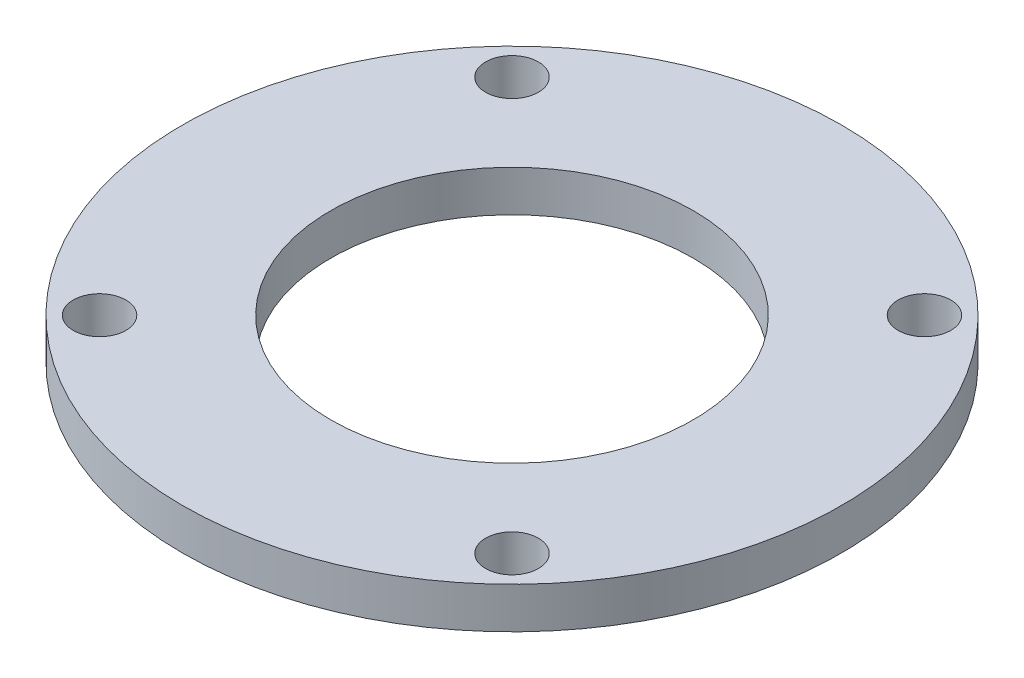
ISO-10303-21;
HEADER;
FILE_DESCRIPTION(('STEP AP214'),'2;1');
FILE_NAME('part.step','',(''),(''),'','','');
FILE_SCHEMA(('AUTOMOTIVE_DESIGN { 1 0 10303 214 1 1 1 1 }'));
ENDSEC;
DATA;
#1=APPLICATION_CONTEXT('core data for automotive mechanical design processes');
#2=APPLICATION_PROTOCOL_DEFINITION('international standard','automotive_design',2000,#1);
#3=PRODUCT_CONTEXT('',#1,'mechanical');
#4=PRODUCT('Part','Part','',(#3));
#5=PRODUCT_RELATED_PRODUCT_CATEGORY('part','',(#4));
#6=PRODUCT_DEFINITION_FORMATION('','',#4);
#7=PRODUCT_DEFINITION_CONTEXT('part definition',#1,'design');
#8=PRODUCT_DEFINITION('design','',#6,#7);
#9=PRODUCT_DEFINITION_SHAPE('','',#8);
#10=(LENGTH_UNIT() NAMED_UNIT(*) SI_UNIT(.MILLI.,.METRE.));
#11=(NAMED_UNIT(*) PLANE_ANGLE_UNIT() SI_UNIT($,.RADIAN.));
#12=(NAMED_UNIT(*) SI_UNIT($,.STERADIAN.) SOLID_ANGLE_UNIT());
#13=UNCERTAINTY_MEASURE_WITH_UNIT(LENGTH_MEASURE(1.E-05),#10,'distance_accuracy_value','');
#14=(GEOMETRIC_REPRESENTATION_CONTEXT(3) GLOBAL_UNCERTAINTY_ASSIGNED_CONTEXT((#13)) GLOBAL_UNIT_ASSIGNED_CONTEXT((#10,
#11,#12)) REPRESENTATION_CONTEXT('',''));
#15=CARTESIAN_POINT('',(0.,0.,0.));
#16=DIRECTION('',(0.,0.,1.));
#17=DIRECTION('',(1.,0.,0.));
#18=AXIS2_PLACEMENT_3D('',#15,#16,#17);
#19=CARTESIAN_POINT('',(-19.0091828831705,-237.5,-53.2448828787845));
#20=DIRECTION('',(0.,-1.,0.));
#21=DIRECTION('',(0.,0.,-1.));
#22=AXIS2_PLACEMENT_3D('',#19,#20,#21);
#23=CYLINDRICAL_SURFACE('',#22,20.);
#24=CARTESIAN_POINT('',(-19.0091828831705,-237.5,-53.2448828787845));
#25=DIRECTION('',(0.,1.,0.));
#26=DIRECTION('',(0.,0.,1.));
#27=AXIS2_PLACEMENT_3D('',#24,#25,#26);
#28=CIRCLE('',#27,20.);
#29=CARTESIAN_POINT('',(-19.0091828831705,-237.5,-33.2448828787845));
#30=VERTEX_POINT('',#29);
#31=EDGE_CURVE('E10',#30,#30,#28,.T.);
#32=ORIENTED_EDGE('',*,*,#31,.F.);
#33=EDGE_LOOP('',(#32));
#34=FACE_BOUND('',#33,.T.);
#35=CARTESIAN_POINT('',(-19.0091828831705,-240.,-53.2448828787845));
#36=DIRECTION('',(0.,1.,0.));
#37=DIRECTION('',(0.,0.,1.));
#38=AXIS2_PLACEMENT_3D('',#35,#36,#37);
#39=CIRCLE('',#38,20.);
#40=CARTESIAN_POINT('',(-19.0091828831705,-240.,-33.2448828787845));
#41=VERTEX_POINT('',#40);
#42=EDGE_CURVE('E46',#41,#41,#39,.T.);
#43=ORIENTED_EDGE('',*,*,#42,.T.);
#44=EDGE_LOOP('',(#43));
#45=FACE_BOUND('',#44,.T.);
#46=ADVANCED_FACE('F39',(#34,#45),#23,.T.);
#47=CARTESIAN_POINT('',(-19.0091828831705,-237.5,-53.2448828787845));
#48=DIRECTION('',(0.,1.,0.));
#49=DIRECTION('',(0.,0.,1.));
#50=AXIS2_PLACEMENT_3D('',#47,#48,#49);
#51=PLANE('',#50);
#52=CARTESIAN_POINT('',(-6.49339285616864,-237.5,-65.7606729057864));
#53=DIRECTION('',(0.,1.,0.));
#54=DIRECTION('',(0.,0.,1.));
#55=AXIS2_PLACEMENT_3D('',#52,#53,#54);
#56=CIRCLE('',#55,1.6);
#57=CARTESIAN_POINT('',(-6.49339285616864,-237.5,-67.3606729057864));
#58=VERTEX_POINT('',#57);
#59=EDGE_CURVE('E56',#58,#58,#56,.F.);
#60=ORIENTED_EDGE('',*,*,#59,.T.);
#61=EDGE_LOOP('',(#60));
#62=FACE_BOUND('',#61,.T.);
#63=CARTESIAN_POINT('',(-31.5249729101724,-237.5,-65.7606729057864));
#64=DIRECTION('',(0.,1.,0.));
#65=DIRECTION('',(0.,0.,1.));
#66=AXIS2_PLACEMENT_3D('',#63,#64,#65);
#67=CIRCLE('',#66,1.6);
#68=CARTESIAN_POINT('',(-31.5249729101724,-237.5,-67.3606729057864));
#69=VERTEX_POINT('',#68);
#70=EDGE_CURVE('E68',#69,#69,#67,.F.);
#71=ORIENTED_EDGE('',*,*,#70,.T.);
#72=EDGE_LOOP('',(#71));
#73=FACE_BOUND('',#72,.T.);
#74=CARTESIAN_POINT('',(-31.5249729101724,-237.5,-40.7290928517826));
#75=DIRECTION('',(0.,1.,0.));
#76=DIRECTION('',(0.,0.,1.));
#77=AXIS2_PLACEMENT_3D('',#74,#75,#76);
#78=CIRCLE('',#77,1.6);
#79=CARTESIAN_POINT('',(-31.5249729101724,-237.5,-42.3290928517826));
#80=VERTEX_POINT('',#79);
#81=EDGE_CURVE('E66',#80,#80,#78,.F.);
#82=ORIENTED_EDGE('',*,*,#81,.T.);
#83=EDGE_LOOP('',(#82));
#84=FACE_BOUND('',#83,.T.);
#85=CARTESIAN_POINT('',(-6.49339285616864,-237.5,-40.7290928517826));
#86=DIRECTION('',(0.,1.,0.));
#87=DIRECTION('',(0.,0.,1.));
#88=AXIS2_PLACEMENT_3D('',#85,#86,#87);
#89=CIRCLE('',#88,1.6);
#90=CARTESIAN_POINT('',(-6.49339285616864,-237.5,-42.3290928517826));
#91=VERTEX_POINT('',#90);
#92=EDGE_CURVE('E63',#91,#91,#89,.F.);
#93=ORIENTED_EDGE('',*,*,#92,.T.);
#94=EDGE_LOOP('',(#93));
#95=FACE_BOUND('',#94,.T.);
#96=CARTESIAN_POINT('',(-19.0091828831705,-237.5,-53.2448828787845));
#97=DIRECTION('',(0.,1.,0.));
#98=DIRECTION('',(0.,0.,1.));
#99=AXIS2_PLACEMENT_3D('',#96,#97,#98);
#100=CIRCLE('',#99,11.);
#101=CARTESIAN_POINT('',(-19.0091828831705,-237.5,-64.2448828787845));
#102=VERTEX_POINT('',#101);
#103=EDGE_CURVE('E51',#102,#102,#100,.F.);
#104=ORIENTED_EDGE('',*,*,#103,.T.);
#105=EDGE_LOOP('',(#104));
#106=FACE_BOUND('',#105,.T.);
#107=ORIENTED_EDGE('',*,*,#31,.T.);
#108=EDGE_LOOP('',(#107));
#109=FACE_BOUND('',#108,.T.);
#110=ADVANCED_FACE('F93',(#62,#73,#84,#95,#106,#109),#51,.T.);
#111=CARTESIAN_POINT('',(-19.0091828831705,-240.,-53.2448828787845));
#112=DIRECTION('',(0.,1.,0.));
#113=DIRECTION('',(0.,0.,1.));
#114=AXIS2_PLACEMENT_3D('',#111,#112,#113);
#115=PLANE('',#114);
#116=CARTESIAN_POINT('',(-6.49339285616864,-240.,-65.7606729057864));
#117=DIRECTION('',(0.,1.,0.));
#118=DIRECTION('',(0.,0.,1.));
#119=AXIS2_PLACEMENT_3D('',#116,#117,#118);
#120=CIRCLE('',#119,1.6);
#121=CARTESIAN_POINT('',(-6.49339285616864,-240.,-67.3606729057864));
#122=VERTEX_POINT('',#121);
#123=EDGE_CURVE('E45',#122,#122,#120,.F.);
#124=ORIENTED_EDGE('',*,*,#123,.F.);
#125=EDGE_LOOP('',(#124));
#126=FACE_BOUND('',#125,.T.);
#127=CARTESIAN_POINT('',(-31.5249729101724,-240.,-65.7606729057864));
#128=DIRECTION('',(0.,1.,0.));
#129=DIRECTION('',(0.,0.,1.));
#130=AXIS2_PLACEMENT_3D('',#127,#128,#129);
#131=CIRCLE('',#130,1.6);
#132=CARTESIAN_POINT('',(-31.5249729101724,-240.,-67.3606729057864));
#133=VERTEX_POINT('',#132);
#134=EDGE_CURVE('E70',#133,#133,#131,.F.);
#135=ORIENTED_EDGE('',*,*,#134,.F.);
#136=EDGE_LOOP('',(#135));
#137=FACE_BOUND('',#136,.T.);
#138=CARTESIAN_POINT('',(-31.5249729101724,-240.,-40.7290928517826));
#139=DIRECTION('',(0.,1.,0.));
#140=DIRECTION('',(0.,0.,1.));
#141=AXIS2_PLACEMENT_3D('',#138,#139,#140);
#142=CIRCLE('',#141,1.6);
#143=CARTESIAN_POINT('',(-31.5249729101724,-240.,-42.3290928517826));
#144=VERTEX_POINT('',#143);
#145=EDGE_CURVE('E64',#144,#144,#142,.F.);
#146=ORIENTED_EDGE('',*,*,#145,.F.);
#147=EDGE_LOOP('',(#146));
#148=FACE_BOUND('',#147,.T.);
#149=CARTESIAN_POINT('',(-6.49339285616864,-240.,-40.7290928517826));
#150=DIRECTION('',(0.,1.,0.));
#151=DIRECTION('',(0.,0.,1.));
#152=AXIS2_PLACEMENT_3D('',#149,#150,#151);
#153=CIRCLE('',#152,1.6);
#154=CARTESIAN_POINT('',(-6.49339285616864,-240.,-42.3290928517826));
#155=VERTEX_POINT('',#154);
#156=EDGE_CURVE('E58',#155,#155,#153,.F.);
#157=ORIENTED_EDGE('',*,*,#156,.F.);
#158=EDGE_LOOP('',(#157));
#159=FACE_BOUND('',#158,.T.);
#160=CARTESIAN_POINT('',(-19.0091828831705,-240.,-53.2448828787845));
#161=DIRECTION('',(0.,1.,0.));
#162=DIRECTION('',(0.,0.,1.));
#163=AXIS2_PLACEMENT_3D('',#160,#161,#162);
#164=CIRCLE('',#163,11.);
#165=CARTESIAN_POINT('',(-19.0091828831705,-240.,-64.2448828787845));
#166=VERTEX_POINT('',#165);
#167=EDGE_CURVE('E57',#166,#166,#164,.F.);
#168=ORIENTED_EDGE('',*,*,#167,.F.);
#169=EDGE_LOOP('',(#168));
#170=FACE_BOUND('',#169,.T.);
#171=ORIENTED_EDGE('',*,*,#42,.F.);
#172=EDGE_LOOP('',(#171));
#173=FACE_BOUND('',#172,.T.);
#174=ADVANCED_FACE('F87',(#126,#137,#148,#159,#170,#173),#115,.F.);
#175=CARTESIAN_POINT('',(-19.0091828831705,-237.4,-53.2448828787845));
#176=DIRECTION('',(0.,-1.,0.));
#177=DIRECTION('',(0.,0.,-1.));
#178=AXIS2_PLACEMENT_3D('',#175,#176,#177);
#179=CYLINDRICAL_SURFACE('',#178,11.);
#180=CARTESIAN_POINT('',(-19.0091828831705,-237.5,-64.2448828787845));
#181=CARTESIAN_POINT('',(-19.0091828831705,-237.526041666667,-64.2448828787845));
#182=CARTESIAN_POINT('',(-19.0091828831705,-237.552083333333,-64.2448828787845));
#183=CARTESIAN_POINT('',(-19.0091828831705,-237.604166666667,-64.2448828787845));
#184=CARTESIAN_POINT('',(-19.0091828831705,-237.630208333333,-64.2448828787845));
#185=CARTESIAN_POINT('',(-19.0091828831705,-237.682291666667,-64.2448828787845));
#186=CARTESIAN_POINT('',(-19.0091828831705,-237.708333333333,-64.2448828787845));
#187=CARTESIAN_POINT('',(-19.0091828831705,-237.760416666667,-64.2448828787845));
#188=CARTESIAN_POINT('',(-19.0091828831705,-237.786458333333,-64.2448828787845));
#189=CARTESIAN_POINT('',(-19.0091828831705,-237.838541666667,-64.2448828787845));
#190=CARTESIAN_POINT('',(-19.0091828831705,-237.864583333333,-64.2448828787845));
#191=CARTESIAN_POINT('',(-19.0091828831705,-237.916666666667,-64.2448828787845));
#192=CARTESIAN_POINT('',(-19.0091828831705,-237.942708333333,-64.2448828787845));
#193=CARTESIAN_POINT('',(-19.0091828831705,-237.994791666667,-64.2448828787845));
#194=CARTESIAN_POINT('',(-19.0091828831705,-238.020833333333,-64.2448828787845));
#195=CARTESIAN_POINT('',(-19.0091828831705,-238.072916666667,-64.2448828787845));
#196=CARTESIAN_POINT('',(-19.0091828831705,-238.098958333333,-64.2448828787845));
#197=CARTESIAN_POINT('',(-19.0091828831705,-238.151041666667,-64.2448828787845));
#198=CARTESIAN_POINT('',(-19.0091828831705,-238.177083333333,-64.2448828787845));
#199=CARTESIAN_POINT('',(-19.0091828831705,-238.229166666667,-64.2448828787845));
#200=CARTESIAN_POINT('',(-19.0091828831705,-238.255208333333,-64.2448828787845));
#201=CARTESIAN_POINT('',(-19.0091828831705,-238.307291666667,-64.2448828787845));
#202=CARTESIAN_POINT('',(-19.0091828831705,-238.333333333333,-64.2448828787845));
#203=CARTESIAN_POINT('',(-19.0091828831705,-238.385416666667,-64.2448828787845));
#204=CARTESIAN_POINT('',(-19.0091828831705,-238.411458333333,-64.2448828787845));
#205=CARTESIAN_POINT('',(-19.0091828831705,-238.463541666667,-64.2448828787845));
#206=CARTESIAN_POINT('',(-19.0091828831705,-238.489583333333,-64.2448828787845));
#207=CARTESIAN_POINT('',(-19.0091828831705,-238.541666666667,-64.2448828787845));
#208=CARTESIAN_POINT('',(-19.0091828831705,-238.567708333333,-64.2448828787845));
#209=CARTESIAN_POINT('',(-19.0091828831705,-238.619791666667,-64.2448828787845));
#210=CARTESIAN_POINT('',(-19.0091828831705,-238.645833333333,-64.2448828787845));
#211=CARTESIAN_POINT('',(-19.0091828831705,-238.697916666667,-64.2448828787845));
#212=CARTESIAN_POINT('',(-19.0091828831705,-238.723958333333,-64.2448828787845));
#213=CARTESIAN_POINT('',(-19.0091828831705,-238.776041666667,-64.2448828787845));
#214=CARTESIAN_POINT('',(-19.0091828831705,-238.802083333333,-64.2448828787845));
#215=CARTESIAN_POINT('',(-19.0091828831705,-238.854166666667,-64.2448828787845));
#216=CARTESIAN_POINT('',(-19.0091828831705,-238.880208333333,-64.2448828787845));
#217=CARTESIAN_POINT('',(-19.0091828831705,-238.932291666667,-64.2448828787845));
#218=CARTESIAN_POINT('',(-19.0091828831705,-238.958333333333,-64.2448828787845));
#219=CARTESIAN_POINT('',(-19.0091828831705,-239.010416666667,-64.2448828787845));
#220=CARTESIAN_POINT('',(-19.0091828831705,-239.036458333333,-64.2448828787845));
#221=CARTESIAN_POINT('',(-19.0091828831705,-239.088541666667,-64.2448828787845));
#222=CARTESIAN_POINT('',(-19.0091828831705,-239.114583333333,-64.2448828787845));
#223=CARTESIAN_POINT('',(-19.0091828831705,-239.166666666667,-64.2448828787845));
#224=CARTESIAN_POINT('',(-19.0091828831705,-239.192708333333,-64.2448828787845));
#225=CARTESIAN_POINT('',(-19.0091828831705,-239.244791666667,-64.2448828787845));
#226=CARTESIAN_POINT('',(-19.0091828831705,-239.270833333333,-64.2448828787845));
#227=CARTESIAN_POINT('',(-19.0091828831705,-239.322916666667,-64.2448828787845));
#228=CARTESIAN_POINT('',(-19.0091828831705,-239.348958333333,-64.2448828787845));
#229=CARTESIAN_POINT('',(-19.0091828831705,-239.401041666667,-64.2448828787845));
#230=CARTESIAN_POINT('',(-19.0091828831705,-239.427083333333,-64.2448828787845));
#231=CARTESIAN_POINT('',(-19.0091828831705,-239.479166666667,-64.2448828787845));
#232=CARTESIAN_POINT('',(-19.0091828831705,-239.505208333333,-64.2448828787845));
#233=CARTESIAN_POINT('',(-19.0091828831705,-239.557291666667,-64.2448828787845));
#234=CARTESIAN_POINT('',(-19.0091828831705,-239.583333333333,-64.2448828787845));
#235=CARTESIAN_POINT('',(-19.0091828831705,-239.635416666667,-64.2448828787845));
#236=CARTESIAN_POINT('',(-19.0091828831705,-239.661458333333,-64.2448828787845));
#237=CARTESIAN_POINT('',(-19.0091828831705,-239.713541666667,-64.2448828787845));
#238=CARTESIAN_POINT('',(-19.0091828831705,-239.739583333333,-64.2448828787845));
#239=CARTESIAN_POINT('',(-19.0091828831705,-239.791666666667,-64.2448828787845));
#240=CARTESIAN_POINT('',(-19.0091828831705,-239.817708333333,-64.2448828787845));
#241=CARTESIAN_POINT('',(-19.0091828831705,-239.869791666667,-64.2448828787845));
#242=CARTESIAN_POINT('',(-19.0091828831705,-239.895833333333,-64.2448828787845));
#243=CARTESIAN_POINT('',(-19.0091828831705,-239.947916666667,-64.2448828787845));
#244=CARTESIAN_POINT('',(-19.0091828831705,-239.973958333333,-64.2448828787845));
#245=CARTESIAN_POINT('',(-19.0091828831705,-240.,-64.2448828787845));
#246=B_SPLINE_CURVE_WITH_KNOTS('',3,(#180,#181,#182,#183,#184,#185,#186,#187,#188,#189,#190,
#191,#192,#193,#194,#195,#196,#197,#198,#199,#200,#201,#202,#203,#204,#205,#206,#207,#208,#209,
#210,#211,#212,#213,#214,#215,#216,#217,#218,#219,#220,#221,#222,#223,#224,#225,#226,#227,#228,
#229,#230,#231,#232,#233,#234,#235,#236,#237,#238,#239,#240,#241,#242,#243,#244,#245),
.UNSPECIFIED.,.F.,.F.,(4,2,2,2,2,2,2,2,2,2,2,2,2,2,2,2,2,2,2,2,2,2,2,2,2,2,2,2,2,2,2,2,4),(0.,
0.0781249999999845,0.156249999999997,0.234374999999981,0.312499999999993,0.390624999999978,
0.46874999999999,0.546874999999974,0.624999999999987,0.703124999999999,0.781249999999983,
0.859374999999996,0.93749999999998,1.01562499999999,1.09374999999998,1.17187499999999,1.25,
1.32812499999999,1.40625,1.48437499999998,1.56249999999999,1.64062499999998,1.71874999999999,
1.79687499999998,1.87499999999999,1.953125,2.03124999999998,2.109375,2.18749999999998,
2.26562499999999,2.34374999999998,2.42187499999999,2.5),.UNSPECIFIED.);
#247=EDGE_CURVE('BSEAM89',#102,#166,#246,.T.);
#248=ORIENTED_EDGE('',*,*,#103,.F.);
#249=ORIENTED_EDGE('',*,*,#167,.T.);
#250=ORIENTED_EDGE('',*,*,#247,.T.);
#251=ORIENTED_EDGE('',*,*,#247,.F.);
#252=EDGE_LOOP('',(#248,#250,#249,#251));
#253=FACE_BOUND('',#252,.T.);
#254=ADVANCED_FACE('F89',(#253),#179,.F.);
#255=CARTESIAN_POINT('',(-6.49339285616864,-237.4,-40.7290928517826));
#256=DIRECTION('',(0.,-1.,0.));
#257=DIRECTION('',(0.,0.,-1.));
#258=AXIS2_PLACEMENT_3D('',#255,#256,#257);
#259=CYLINDRICAL_SURFACE('',#258,1.6);
#260=CARTESIAN_POINT('',(-6.49339285616864,-237.5,-42.3290928517826));
#261=CARTESIAN_POINT('',(-6.49339285616864,-237.526041666667,-42.3290928517826));
#262=CARTESIAN_POINT('',(-6.49339285616864,-237.552083333333,-42.3290928517826));
#263=CARTESIAN_POINT('',(-6.49339285616864,-237.604166666667,-42.3290928517826));
#264=CARTESIAN_POINT('',(-6.49339285616864,-237.630208333333,-42.3290928517826));
#265=CARTESIAN_POINT('',(-6.49339285616864,-237.682291666667,-42.3290928517826));
#266=CARTESIAN_POINT('',(-6.49339285616864,-237.708333333333,-42.3290928517826));
#267=CARTESIAN_POINT('',(-6.49339285616864,-237.760416666667,-42.3290928517826));
#268=CARTESIAN_POINT('',(-6.49339285616864,-237.786458333333,-42.3290928517826));
#269=CARTESIAN_POINT('',(-6.49339285616864,-237.838541666667,-42.3290928517826));
#270=CARTESIAN_POINT('',(-6.49339285616864,-237.864583333333,-42.3290928517826));
#271=CARTESIAN_POINT('',(-6.49339285616864,-237.916666666667,-42.3290928517826));
#272=CARTESIAN_POINT('',(-6.49339285616864,-237.942708333333,-42.3290928517826));
#273=CARTESIAN_POINT('',(-6.49339285616864,-237.994791666667,-42.3290928517826));
#274=CARTESIAN_POINT('',(-6.49339285616864,-238.020833333333,-42.3290928517826));
#275=CARTESIAN_POINT('',(-6.49339285616864,-238.072916666667,-42.3290928517826));
#276=CARTESIAN_POINT('',(-6.49339285616864,-238.098958333333,-42.3290928517826));
#277=CARTESIAN_POINT('',(-6.49339285616864,-238.151041666667,-42.3290928517826));
#278=CARTESIAN_POINT('',(-6.49339285616864,-238.177083333333,-42.3290928517826));
#279=CARTESIAN_POINT('',(-6.49339285616864,-238.229166666667,-42.3290928517826));
#280=CARTESIAN_POINT('',(-6.49339285616864,-238.255208333333,-42.3290928517826));
#281=CARTESIAN_POINT('',(-6.49339285616864,-238.307291666667,-42.3290928517826));
#282=CARTESIAN_POINT('',(-6.49339285616864,-238.333333333333,-42.3290928517826));
#283=CARTESIAN_POINT('',(-6.49339285616864,-238.385416666667,-42.3290928517826));
#284=CARTESIAN_POINT('',(-6.49339285616864,-238.411458333333,-42.3290928517826));
#285=CARTESIAN_POINT('',(-6.49339285616864,-238.463541666667,-42.3290928517826));
#286=CARTESIAN_POINT('',(-6.49339285616864,-238.489583333333,-42.3290928517826));
#287=CARTESIAN_POINT('',(-6.49339285616864,-238.541666666667,-42.3290928517826));
#288=CARTESIAN_POINT('',(-6.49339285616864,-238.567708333333,-42.3290928517826));
#289=CARTESIAN_POINT('',(-6.49339285616864,-238.619791666667,-42.3290928517826));
#290=CARTESIAN_POINT('',(-6.49339285616864,-238.645833333333,-42.3290928517826));
#291=CARTESIAN_POINT('',(-6.49339285616864,-238.697916666667,-42.3290928517826));
#292=CARTESIAN_POINT('',(-6.49339285616864,-238.723958333333,-42.3290928517826));
#293=CARTESIAN_POINT('',(-6.49339285616864,-238.776041666667,-42.3290928517826));
#294=CARTESIAN_POINT('',(-6.49339285616864,-238.802083333333,-42.3290928517826));
#295=CARTESIAN_POINT('',(-6.49339285616864,-238.854166666667,-42.3290928517826));
#296=CARTESIAN_POINT('',(-6.49339285616864,-238.880208333333,-42.3290928517826));
#297=CARTESIAN_POINT('',(-6.49339285616864,-238.932291666667,-42.3290928517826));
#298=CARTESIAN_POINT('',(-6.49339285616864,-238.958333333333,-42.3290928517826));
#299=CARTESIAN_POINT('',(-6.49339285616864,-239.010416666667,-42.3290928517826));
#300=CARTESIAN_POINT('',(-6.49339285616864,-239.036458333333,-42.3290928517826));
#301=CARTESIAN_POINT('',(-6.49339285616864,-239.088541666667,-42.3290928517826));
#302=CARTESIAN_POINT('',(-6.49339285616864,-239.114583333333,-42.3290928517826));
#303=CARTESIAN_POINT('',(-6.49339285616864,-239.166666666667,-42.3290928517826));
#304=CARTESIAN_POINT('',(-6.49339285616864,-239.192708333333,-42.3290928517826));
#305=CARTESIAN_POINT('',(-6.49339285616864,-239.244791666667,-42.3290928517826));
#306=CARTESIAN_POINT('',(-6.49339285616864,-239.270833333333,-42.3290928517826));
#307=CARTESIAN_POINT('',(-6.49339285616864,-239.322916666667,-42.3290928517826));
#308=CARTESIAN_POINT('',(-6.49339285616864,-239.348958333333,-42.3290928517826));
#309=CARTESIAN_POINT('',(-6.49339285616864,-239.401041666667,-42.3290928517826));
#310=CARTESIAN_POINT('',(-6.49339285616864,-239.427083333333,-42.3290928517826));
#311=CARTESIAN_POINT('',(-6.49339285616864,-239.479166666667,-42.3290928517826));
#312=CARTESIAN_POINT('',(-6.49339285616864,-239.505208333333,-42.3290928517826));
#313=CARTESIAN_POINT('',(-6.49339285616864,-239.557291666667,-42.3290928517826));
#314=CARTESIAN_POINT('',(-6.49339285616864,-239.583333333333,-42.3290928517826));
#315=CARTESIAN_POINT('',(-6.49339285616864,-239.635416666667,-42.3290928517826));
#316=CARTESIAN_POINT('',(-6.49339285616864,-239.661458333333,-42.3290928517826));
#317=CARTESIAN_POINT('',(-6.49339285616864,-239.713541666667,-42.3290928517826));
#318=CARTESIAN_POINT('',(-6.49339285616864,-239.739583333333,-42.3290928517826));
#319=CARTESIAN_POINT('',(-6.49339285616864,-239.791666666667,-42.3290928517826));
#320=CARTESIAN_POINT('',(-6.49339285616864,-239.817708333333,-42.3290928517826));
#321=CARTESIAN_POINT('',(-6.49339285616864,-239.869791666667,-42.3290928517826));
#322=CARTESIAN_POINT('',(-6.49339285616864,-239.895833333333,-42.3290928517826));
#323=CARTESIAN_POINT('',(-6.49339285616864,-239.947916666667,-42.3290928517826));
#324=CARTESIAN_POINT('',(-6.49339285616864,-239.973958333333,-42.3290928517826));
#325=CARTESIAN_POINT('',(-6.49339285616864,-240.,-42.3290928517826));
#326=B_SPLINE_CURVE_WITH_KNOTS('',3,(#260,#261,#262,#263,#264,#265,#266,#267,#268,#269,#270,
#271,#272,#273,#274,#275,#276,#277,#278,#279,#280,#281,#282,#283,#284,#285,#286,#287,#288,#289,
#290,#291,#292,#293,#294,#295,#296,#297,#298,#299,#300,#301,#302,#303,#304,#305,#306,#307,#308,
#309,#310,#311,#312,#313,#314,#315,#316,#317,#318,#319,#320,#321,#322,#323,#324,#325),
.UNSPECIFIED.,.F.,.F.,(4,2,2,2,2,2,2,2,2,2,2,2,2,2,2,2,2,2,2,2,2,2,2,2,2,2,2,2,2,2,2,2,4),(0.,
0.0781249999999845,0.156249999999997,0.234374999999981,0.312499999999993,0.390624999999978,
0.46874999999999,0.546874999999974,0.624999999999987,0.703124999999999,0.781249999999983,
0.859374999999996,0.93749999999998,1.01562499999999,1.09374999999998,1.17187499999999,1.25,
1.32812499999999,1.40625,1.48437499999998,1.56249999999999,1.64062499999998,1.71874999999999,
1.79687499999998,1.87499999999999,1.953125,2.03124999999998,2.109375,2.18749999999998,
2.26562499999999,2.34374999999998,2.42187499999999,2.5),.UNSPECIFIED.);
#327=EDGE_CURVE('BSEAM114',#91,#155,#326,.T.);
#328=ORIENTED_EDGE('',*,*,#92,.F.);
#329=ORIENTED_EDGE('',*,*,#156,.T.);
#330=ORIENTED_EDGE('',*,*,#327,.T.);
#331=ORIENTED_EDGE('',*,*,#327,.F.);
#332=EDGE_LOOP('',(#328,#330,#329,#331));
#333=FACE_BOUND('',#332,.T.);
#334=ADVANCED_FACE('F114',(#333),#259,.F.);
#335=CARTESIAN_POINT('',(-31.5249729101724,-237.4,-40.7290928517826));
#336=DIRECTION('',(0.,-1.,0.));
#337=DIRECTION('',(0.,0.,-1.));
#338=AXIS2_PLACEMENT_3D('',#335,#336,#337);
#339=CYLINDRICAL_SURFACE('',#338,1.6);
#340=CARTESIAN_POINT('',(-31.5249729101724,-237.5,-42.3290928517826));
#341=CARTESIAN_POINT('',(-31.5249729101724,-237.526041666667,-42.3290928517826));
#342=CARTESIAN_POINT('',(-31.5249729101724,-237.552083333333,-42.3290928517826));
#343=CARTESIAN_POINT('',(-31.5249729101724,-237.604166666667,-42.3290928517826));
#344=CARTESIAN_POINT('',(-31.5249729101724,-237.630208333333,-42.3290928517826));
#345=CARTESIAN_POINT('',(-31.5249729101724,-237.682291666667,-42.3290928517826));
#346=CARTESIAN_POINT('',(-31.5249729101724,-237.708333333333,-42.3290928517826));
#347=CARTESIAN_POINT('',(-31.5249729101724,-237.760416666667,-42.3290928517826));
#348=CARTESIAN_POINT('',(-31.5249729101724,-237.786458333333,-42.3290928517826));
#349=CARTESIAN_POINT('',(-31.5249729101724,-237.838541666667,-42.3290928517826));
#350=CARTESIAN_POINT('',(-31.5249729101724,-237.864583333333,-42.3290928517826));
#351=CARTESIAN_POINT('',(-31.5249729101724,-237.916666666667,-42.3290928517826));
#352=CARTESIAN_POINT('',(-31.5249729101724,-237.942708333333,-42.3290928517826));
#353=CARTESIAN_POINT('',(-31.5249729101724,-237.994791666667,-42.3290928517826));
#354=CARTESIAN_POINT('',(-31.5249729101724,-238.020833333333,-42.3290928517826));
#355=CARTESIAN_POINT('',(-31.5249729101724,-238.072916666667,-42.3290928517826));
#356=CARTESIAN_POINT('',(-31.5249729101724,-238.098958333333,-42.3290928517826));
#357=CARTESIAN_POINT('',(-31.5249729101724,-238.151041666667,-42.3290928517826));
#358=CARTESIAN_POINT('',(-31.5249729101724,-238.177083333333,-42.3290928517826));
#359=CARTESIAN_POINT('',(-31.5249729101724,-238.229166666667,-42.3290928517826));
#360=CARTESIAN_POINT('',(-31.5249729101724,-238.255208333333,-42.3290928517826));
#361=CARTESIAN_POINT('',(-31.5249729101724,-238.307291666667,-42.3290928517826));
#362=CARTESIAN_POINT('',(-31.5249729101724,-238.333333333333,-42.3290928517826));
#363=CARTESIAN_POINT('',(-31.5249729101724,-238.385416666667,-42.3290928517826));
#364=CARTESIAN_POINT('',(-31.5249729101724,-238.411458333333,-42.3290928517826));
#365=CARTESIAN_POINT('',(-31.5249729101724,-238.463541666667,-42.3290928517826));
#366=CARTESIAN_POINT('',(-31.5249729101724,-238.489583333333,-42.3290928517826));
#367=CARTESIAN_POINT('',(-31.5249729101724,-238.541666666667,-42.3290928517826));
#368=CARTESIAN_POINT('',(-31.5249729101724,-238.567708333333,-42.3290928517826));
#369=CARTESIAN_POINT('',(-31.5249729101724,-238.619791666667,-42.3290928517826));
#370=CARTESIAN_POINT('',(-31.5249729101724,-238.645833333333,-42.3290928517826));
#371=CARTESIAN_POINT('',(-31.5249729101724,-238.697916666667,-42.3290928517826));
#372=CARTESIAN_POINT('',(-31.5249729101724,-238.723958333333,-42.3290928517826));
#373=CARTESIAN_POINT('',(-31.5249729101724,-238.776041666667,-42.3290928517826));
#374=CARTESIAN_POINT('',(-31.5249729101724,-238.802083333333,-42.3290928517826));
#375=CARTESIAN_POINT('',(-31.5249729101724,-238.854166666667,-42.3290928517826));
#376=CARTESIAN_POINT('',(-31.5249729101724,-238.880208333333,-42.3290928517826));
#377=CARTESIAN_POINT('',(-31.5249729101724,-238.932291666667,-42.3290928517826));
#378=CARTESIAN_POINT('',(-31.5249729101724,-238.958333333333,-42.3290928517826));
#379=CARTESIAN_POINT('',(-31.5249729101724,-239.010416666667,-42.3290928517826));
#380=CARTESIAN_POINT('',(-31.5249729101724,-239.036458333333,-42.3290928517826));
#381=CARTESIAN_POINT('',(-31.5249729101724,-239.088541666667,-42.3290928517826));
#382=CARTESIAN_POINT('',(-31.5249729101724,-239.114583333333,-42.3290928517826));
#383=CARTESIAN_POINT('',(-31.5249729101724,-239.166666666667,-42.3290928517826));
#384=CARTESIAN_POINT('',(-31.5249729101724,-239.192708333333,-42.3290928517826));
#385=CARTESIAN_POINT('',(-31.5249729101724,-239.244791666667,-42.3290928517826));
#386=CARTESIAN_POINT('',(-31.5249729101724,-239.270833333333,-42.3290928517826));
#387=CARTESIAN_POINT('',(-31.5249729101724,-239.322916666667,-42.3290928517826));
#388=CARTESIAN_POINT('',(-31.5249729101724,-239.348958333333,-42.3290928517826));
#389=CARTESIAN_POINT('',(-31.5249729101724,-239.401041666667,-42.3290928517826));
#390=CARTESIAN_POINT('',(-31.5249729101724,-239.427083333333,-42.3290928517826));
#391=CARTESIAN_POINT('',(-31.5249729101724,-239.479166666667,-42.3290928517826));
#392=CARTESIAN_POINT('',(-31.5249729101724,-239.505208333333,-42.3290928517826));
#393=CARTESIAN_POINT('',(-31.5249729101724,-239.557291666667,-42.3290928517826));
#394=CARTESIAN_POINT('',(-31.5249729101724,-239.583333333333,-42.3290928517826));
#395=CARTESIAN_POINT('',(-31.5249729101724,-239.635416666667,-42.3290928517826));
#396=CARTESIAN_POINT('',(-31.5249729101724,-239.661458333333,-42.3290928517826));
#397=CARTESIAN_POINT('',(-31.5249729101724,-239.713541666667,-42.3290928517826));
#398=CARTESIAN_POINT('',(-31.5249729101724,-239.739583333333,-42.3290928517826));
#399=CARTESIAN_POINT('',(-31.5249729101724,-239.791666666667,-42.3290928517826));
#400=CARTESIAN_POINT('',(-31.5249729101724,-239.817708333333,-42.3290928517826));
#401=CARTESIAN_POINT('',(-31.5249729101724,-239.869791666667,-42.3290928517826));
#402=CARTESIAN_POINT('',(-31.5249729101724,-239.895833333333,-42.3290928517826));
#403=CARTESIAN_POINT('',(-31.5249729101724,-239.947916666667,-42.3290928517826));
#404=CARTESIAN_POINT('',(-31.5249729101724,-239.973958333333,-42.3290928517826));
#405=CARTESIAN_POINT('',(-31.5249729101724,-240.,-42.3290928517826));
#406=B_SPLINE_CURVE_WITH_KNOTS('',3,(#340,#341,#342,#343,#344,#345,#346,#347,#348,#349,#350,
#351,#352,#353,#354,#355,#356,#357,#358,#359,#360,#361,#362,#363,#364,#365,#366,#367,#368,#369,
#370,#371,#372,#373,#374,#375,#376,#377,#378,#379,#380,#381,#382,#383,#384,#385,#386,#387,#388,
#389,#390,#391,#392,#393,#394,#395,#396,#397,#398,#399,#400,#401,#402,#403,#404,#405),
.UNSPECIFIED.,.F.,.F.,(4,2,2,2,2,2,2,2,2,2,2,2,2,2,2,2,2,2,2,2,2,2,2,2,2,2,2,2,2,2,2,2,4),(0.,
0.0781249999999845,0.156249999999997,0.234374999999981,0.312499999999993,0.390624999999978,
0.46874999999999,0.546874999999974,0.624999999999987,0.703124999999999,0.781249999999983,
0.859374999999996,0.93749999999998,1.01562499999999,1.09374999999998,1.17187499999999,1.25,
1.32812499999999,1.40625,1.48437499999998,1.56249999999999,1.64062499999998,1.71874999999999,
1.79687499999998,1.87499999999999,1.953125,2.03124999999998,2.109375,2.18749999999998,
2.26562499999999,2.34374999999998,2.42187499999999,2.5),.UNSPECIFIED.);
#407=EDGE_CURVE('BSEAM120',#80,#144,#406,.T.);
#408=ORIENTED_EDGE('',*,*,#81,.F.);
#409=ORIENTED_EDGE('',*,*,#145,.T.);
#410=ORIENTED_EDGE('',*,*,#407,.T.);
#411=ORIENTED_EDGE('',*,*,#407,.F.);
#412=EDGE_LOOP('',(#408,#410,#409,#411));
#413=FACE_BOUND('',#412,.T.);
#414=ADVANCED_FACE('F120',(#413),#339,.F.);
#415=CARTESIAN_POINT('',(-31.5249729101724,-237.4,-65.7606729057864));
#416=DIRECTION('',(0.,-1.,0.));
#417=DIRECTION('',(0.,0.,-1.));
#418=AXIS2_PLACEMENT_3D('',#415,#416,#417);
#419=CYLINDRICAL_SURFACE('',#418,1.6);
#420=CARTESIAN_POINT('',(-31.5249729101724,-237.5,-67.3606729057864));
#421=CARTESIAN_POINT('',(-31.5249729101724,-237.526041666667,-67.3606729057864));
#422=CARTESIAN_POINT('',(-31.5249729101724,-237.552083333333,-67.3606729057864));
#423=CARTESIAN_POINT('',(-31.5249729101724,-237.604166666667,-67.3606729057864));
#424=CARTESIAN_POINT('',(-31.5249729101724,-237.630208333333,-67.3606729057864));
#425=CARTESIAN_POINT('',(-31.5249729101724,-237.682291666667,-67.3606729057864));
#426=CARTESIAN_POINT('',(-31.5249729101724,-237.708333333333,-67.3606729057864));
#427=CARTESIAN_POINT('',(-31.5249729101724,-237.760416666667,-67.3606729057864));
#428=CARTESIAN_POINT('',(-31.5249729101724,-237.786458333333,-67.3606729057864));
#429=CARTESIAN_POINT('',(-31.5249729101724,-237.838541666667,-67.3606729057864));
#430=CARTESIAN_POINT('',(-31.5249729101724,-237.864583333333,-67.3606729057864));
#431=CARTESIAN_POINT('',(-31.5249729101724,-237.916666666667,-67.3606729057864));
#432=CARTESIAN_POINT('',(-31.5249729101724,-237.942708333333,-67.3606729057864));
#433=CARTESIAN_POINT('',(-31.5249729101724,-237.994791666667,-67.3606729057864));
#434=CARTESIAN_POINT('',(-31.5249729101724,-238.020833333333,-67.3606729057864));
#435=CARTESIAN_POINT('',(-31.5249729101724,-238.072916666667,-67.3606729057864));
#436=CARTESIAN_POINT('',(-31.5249729101724,-238.098958333333,-67.3606729057864));
#437=CARTESIAN_POINT('',(-31.5249729101724,-238.151041666667,-67.3606729057864));
#438=CARTESIAN_POINT('',(-31.5249729101724,-238.177083333333,-67.3606729057864));
#439=CARTESIAN_POINT('',(-31.5249729101724,-238.229166666667,-67.3606729057864));
#440=CARTESIAN_POINT('',(-31.5249729101724,-238.255208333333,-67.3606729057864));
#441=CARTESIAN_POINT('',(-31.5249729101724,-238.307291666667,-67.3606729057864));
#442=CARTESIAN_POINT('',(-31.5249729101724,-238.333333333333,-67.3606729057864));
#443=CARTESIAN_POINT('',(-31.5249729101724,-238.385416666667,-67.3606729057864));
#444=CARTESIAN_POINT('',(-31.5249729101724,-238.411458333333,-67.3606729057864));
#445=CARTESIAN_POINT('',(-31.5249729101724,-238.463541666667,-67.3606729057864));
#446=CARTESIAN_POINT('',(-31.5249729101724,-238.489583333333,-67.3606729057864));
#447=CARTESIAN_POINT('',(-31.5249729101724,-238.541666666667,-67.3606729057864));
#448=CARTESIAN_POINT('',(-31.5249729101724,-238.567708333333,-67.3606729057864));
#449=CARTESIAN_POINT('',(-31.5249729101724,-238.619791666667,-67.3606729057864));
#450=CARTESIAN_POINT('',(-31.5249729101724,-238.645833333333,-67.3606729057864));
#451=CARTESIAN_POINT('',(-31.5249729101724,-238.697916666667,-67.3606729057864));
#452=CARTESIAN_POINT('',(-31.5249729101724,-238.723958333333,-67.3606729057864));
#453=CARTESIAN_POINT('',(-31.5249729101724,-238.776041666667,-67.3606729057864));
#454=CARTESIAN_POINT('',(-31.5249729101724,-238.802083333333,-67.3606729057864));
#455=CARTESIAN_POINT('',(-31.5249729101724,-238.854166666667,-67.3606729057864));
#456=CARTESIAN_POINT('',(-31.5249729101724,-238.880208333333,-67.3606729057864));
#457=CARTESIAN_POINT('',(-31.5249729101724,-238.932291666667,-67.3606729057864));
#458=CARTESIAN_POINT('',(-31.5249729101724,-238.958333333333,-67.3606729057864));
#459=CARTESIAN_POINT('',(-31.5249729101724,-239.010416666667,-67.3606729057864));
#460=CARTESIAN_POINT('',(-31.5249729101724,-239.036458333333,-67.3606729057864));
#461=CARTESIAN_POINT('',(-31.5249729101724,-239.088541666667,-67.3606729057864));
#462=CARTESIAN_POINT('',(-31.5249729101724,-239.114583333333,-67.3606729057864));
#463=CARTESIAN_POINT('',(-31.5249729101724,-239.166666666667,-67.3606729057864));
#464=CARTESIAN_POINT('',(-31.5249729101724,-239.192708333333,-67.3606729057864));
#465=CARTESIAN_POINT('',(-31.5249729101724,-239.244791666667,-67.3606729057864));
#466=CARTESIAN_POINT('',(-31.5249729101724,-239.270833333333,-67.3606729057864));
#467=CARTESIAN_POINT('',(-31.5249729101724,-239.322916666667,-67.3606729057864));
#468=CARTESIAN_POINT('',(-31.5249729101724,-239.348958333333,-67.3606729057864));
#469=CARTESIAN_POINT('',(-31.5249729101724,-239.401041666667,-67.3606729057864));
#470=CARTESIAN_POINT('',(-31.5249729101724,-239.427083333333,-67.3606729057864));
#471=CARTESIAN_POINT('',(-31.5249729101724,-239.479166666667,-67.3606729057864));
#472=CARTESIAN_POINT('',(-31.5249729101724,-239.505208333333,-67.3606729057864));
#473=CARTESIAN_POINT('',(-31.5249729101724,-239.557291666667,-67.3606729057864));
#474=CARTESIAN_POINT('',(-31.5249729101724,-239.583333333333,-67.3606729057864));
#475=CARTESIAN_POINT('',(-31.5249729101724,-239.635416666667,-67.3606729057864));
#476=CARTESIAN_POINT('',(-31.5249729101724,-239.661458333333,-67.3606729057864));
#477=CARTESIAN_POINT('',(-31.5249729101724,-239.713541666667,-67.3606729057864));
#478=CARTESIAN_POINT('',(-31.5249729101724,-239.739583333333,-67.3606729057864));
#479=CARTESIAN_POINT('',(-31.5249729101724,-239.791666666667,-67.3606729057864));
#480=CARTESIAN_POINT('',(-31.5249729101724,-239.817708333333,-67.3606729057864));
#481=CARTESIAN_POINT('',(-31.5249729101724,-239.869791666667,-67.3606729057864));
#482=CARTESIAN_POINT('',(-31.5249729101724,-239.895833333333,-67.3606729057864));
#483=CARTESIAN_POINT('',(-31.5249729101724,-239.947916666667,-67.3606729057864));
#484=CARTESIAN_POINT('',(-31.5249729101724,-239.973958333333,-67.3606729057864));
#485=CARTESIAN_POINT('',(-31.5249729101724,-240.,-67.3606729057864));
#486=B_SPLINE_CURVE_WITH_KNOTS('',3,(#420,#421,#422,#423,#424,#425,#426,#427,#428,#429,#430,
#431,#432,#433,#434,#435,#436,#437,#438,#439,#440,#441,#442,#443,#444,#445,#446,#447,#448,#449,
#450,#451,#452,#453,#454,#455,#456,#457,#458,#459,#460,#461,#462,#463,#464,#465,#466,#467,#468,
#469,#470,#471,#472,#473,#474,#475,#476,#477,#478,#479,#480,#481,#482,#483,#484,#485),
.UNSPECIFIED.,.F.,.F.,(4,2,2,2,2,2,2,2,2,2,2,2,2,2,2,2,2,2,2,2,2,2,2,2,2,2,2,2,2,2,2,2,4),(0.,
0.0781249999999845,0.156249999999997,0.234374999999981,0.312499999999993,0.390624999999978,
0.46874999999999,0.546874999999974,0.624999999999987,0.703124999999999,0.781249999999983,
0.859374999999996,0.93749999999998,1.01562499999999,1.09374999999998,1.17187499999999,1.25,
1.32812499999999,1.40625,1.48437499999998,1.56249999999999,1.64062499999998,1.71874999999999,
1.79687499999998,1.87499999999999,1.953125,2.03124999999998,2.109375,2.18749999999998,
2.26562499999999,2.34374999999998,2.42187499999999,2.5),.UNSPECIFIED.);
#487=EDGE_CURVE('BSEAM121',#69,#133,#486,.T.);
#488=ORIENTED_EDGE('',*,*,#70,.F.);
#489=ORIENTED_EDGE('',*,*,#134,.T.);
#490=ORIENTED_EDGE('',*,*,#487,.T.);
#491=ORIENTED_EDGE('',*,*,#487,.F.);
#492=EDGE_LOOP('',(#488,#490,#489,#491));
#493=FACE_BOUND('',#492,.T.);
#494=ADVANCED_FACE('F121',(#493),#419,.F.);
#495=CARTESIAN_POINT('',(-6.49339285616864,-237.4,-65.7606729057864));
#496=DIRECTION('',(0.,-1.,0.));
#497=DIRECTION('',(0.,0.,-1.));
#498=AXIS2_PLACEMENT_3D('',#495,#496,#497);
#499=CYLINDRICAL_SURFACE('',#498,1.6);
#500=CARTESIAN_POINT('',(-6.49339285616864,-237.5,-67.3606729057864));
#501=CARTESIAN_POINT('',(-6.49339285616864,-237.526041666667,-67.3606729057864));
#502=CARTESIAN_POINT('',(-6.49339285616864,-237.552083333333,-67.3606729057864));
#503=CARTESIAN_POINT('',(-6.49339285616864,-237.604166666667,-67.3606729057864));
#504=CARTESIAN_POINT('',(-6.49339285616864,-237.630208333333,-67.3606729057864));
#505=CARTESIAN_POINT('',(-6.49339285616864,-237.682291666667,-67.3606729057864));
#506=CARTESIAN_POINT('',(-6.49339285616864,-237.708333333333,-67.3606729057864));
#507=CARTESIAN_POINT('',(-6.49339285616864,-237.760416666667,-67.3606729057864));
#508=CARTESIAN_POINT('',(-6.49339285616864,-237.786458333333,-67.3606729057864));
#509=CARTESIAN_POINT('',(-6.49339285616864,-237.838541666667,-67.3606729057864));
#510=CARTESIAN_POINT('',(-6.49339285616864,-237.864583333333,-67.3606729057864));
#511=CARTESIAN_POINT('',(-6.49339285616864,-237.916666666667,-67.3606729057864));
#512=CARTESIAN_POINT('',(-6.49339285616864,-237.942708333333,-67.3606729057864));
#513=CARTESIAN_POINT('',(-6.49339285616864,-237.994791666667,-67.3606729057864));
#514=CARTESIAN_POINT('',(-6.49339285616864,-238.020833333333,-67.3606729057864));
#515=CARTESIAN_POINT('',(-6.49339285616864,-238.072916666667,-67.3606729057864));
#516=CARTESIAN_POINT('',(-6.49339285616864,-238.098958333333,-67.3606729057864));
#517=CARTESIAN_POINT('',(-6.49339285616864,-238.151041666667,-67.3606729057864));
#518=CARTESIAN_POINT('',(-6.49339285616864,-238.177083333333,-67.3606729057864));
#519=CARTESIAN_POINT('',(-6.49339285616864,-238.229166666667,-67.3606729057864));
#520=CARTESIAN_POINT('',(-6.49339285616864,-238.255208333333,-67.3606729057864));
#521=CARTESIAN_POINT('',(-6.49339285616864,-238.307291666667,-67.3606729057864));
#522=CARTESIAN_POINT('',(-6.49339285616864,-238.333333333333,-67.3606729057864));
#523=CARTESIAN_POINT('',(-6.49339285616864,-238.385416666667,-67.3606729057864));
#524=CARTESIAN_POINT('',(-6.49339285616864,-238.411458333333,-67.3606729057864));
#525=CARTESIAN_POINT('',(-6.49339285616864,-238.463541666667,-67.3606729057864));
#526=CARTESIAN_POINT('',(-6.49339285616864,-238.489583333333,-67.3606729057864));
#527=CARTESIAN_POINT('',(-6.49339285616864,-238.541666666667,-67.3606729057864));
#528=CARTESIAN_POINT('',(-6.49339285616864,-238.567708333333,-67.3606729057864));
#529=CARTESIAN_POINT('',(-6.49339285616864,-238.619791666667,-67.3606729057864));
#530=CARTESIAN_POINT('',(-6.49339285616864,-238.645833333333,-67.3606729057864));
#531=CARTESIAN_POINT('',(-6.49339285616864,-238.697916666667,-67.3606729057864));
#532=CARTESIAN_POINT('',(-6.49339285616864,-238.723958333333,-67.3606729057864));
#533=CARTESIAN_POINT('',(-6.49339285616864,-238.776041666667,-67.3606729057864));
#534=CARTESIAN_POINT('',(-6.49339285616864,-238.802083333333,-67.3606729057864));
#535=CARTESIAN_POINT('',(-6.49339285616864,-238.854166666667,-67.3606729057864));
#536=CARTESIAN_POINT('',(-6.49339285616864,-238.880208333333,-67.3606729057864));
#537=CARTESIAN_POINT('',(-6.49339285616864,-238.932291666667,-67.3606729057864));
#538=CARTESIAN_POINT('',(-6.49339285616864,-238.958333333333,-67.3606729057864));
#539=CARTESIAN_POINT('',(-6.49339285616864,-239.010416666667,-67.3606729057864));
#540=CARTESIAN_POINT('',(-6.49339285616864,-239.036458333333,-67.3606729057864));
#541=CARTESIAN_POINT('',(-6.49339285616864,-239.088541666667,-67.3606729057864));
#542=CARTESIAN_POINT('',(-6.49339285616864,-239.114583333333,-67.3606729057864));
#543=CARTESIAN_POINT('',(-6.49339285616864,-239.166666666667,-67.3606729057864));
#544=CARTESIAN_POINT('',(-6.49339285616864,-239.192708333333,-67.3606729057864));
#545=CARTESIAN_POINT('',(-6.49339285616864,-239.244791666667,-67.3606729057864));
#546=CARTESIAN_POINT('',(-6.49339285616864,-239.270833333333,-67.3606729057864));
#547=CARTESIAN_POINT('',(-6.49339285616864,-239.322916666667,-67.3606729057864));
#548=CARTESIAN_POINT('',(-6.49339285616864,-239.348958333333,-67.3606729057864));
#549=CARTESIAN_POINT('',(-6.49339285616864,-239.401041666667,-67.3606729057864));
#550=CARTESIAN_POINT('',(-6.49339285616864,-239.427083333333,-67.3606729057864));
#551=CARTESIAN_POINT('',(-6.49339285616864,-239.479166666667,-67.3606729057864));
#552=CARTESIAN_POINT('',(-6.49339285616864,-239.505208333333,-67.3606729057864));
#553=CARTESIAN_POINT('',(-6.49339285616864,-239.557291666667,-67.3606729057864));
#554=CARTESIAN_POINT('',(-6.49339285616864,-239.583333333333,-67.3606729057864));
#555=CARTESIAN_POINT('',(-6.49339285616864,-239.635416666667,-67.3606729057864));
#556=CARTESIAN_POINT('',(-6.49339285616864,-239.661458333333,-67.3606729057864));
#557=CARTESIAN_POINT('',(-6.49339285616864,-239.713541666667,-67.3606729057864));
#558=CARTESIAN_POINT('',(-6.49339285616864,-239.739583333333,-67.3606729057864));
#559=CARTESIAN_POINT('',(-6.49339285616864,-239.791666666667,-67.3606729057864));
#560=CARTESIAN_POINT('',(-6.49339285616864,-239.817708333333,-67.3606729057864));
#561=CARTESIAN_POINT('',(-6.49339285616864,-239.869791666667,-67.3606729057864));
#562=CARTESIAN_POINT('',(-6.49339285616864,-239.895833333333,-67.3606729057864));
#563=CARTESIAN_POINT('',(-6.49339285616864,-239.947916666667,-67.3606729057864));
#564=CARTESIAN_POINT('',(-6.49339285616864,-239.973958333333,-67.3606729057864));
#565=CARTESIAN_POINT('',(-6.49339285616864,-240.,-67.3606729057864));
#566=B_SPLINE_CURVE_WITH_KNOTS('',3,(#500,#501,#502,#503,#504,#505,#506,#507,#508,#509,#510,
#511,#512,#513,#514,#515,#516,#517,#518,#519,#520,#521,#522,#523,#524,#525,#526,#527,#528,#529,
#530,#531,#532,#533,#534,#535,#536,#537,#538,#539,#540,#541,#542,#543,#544,#545,#546,#547,#548,
#549,#550,#551,#552,#553,#554,#555,#556,#557,#558,#559,#560,#561,#562,#563,#564,#565),
.UNSPECIFIED.,.F.,.F.,(4,2,2,2,2,2,2,2,2,2,2,2,2,2,2,2,2,2,2,2,2,2,2,2,2,2,2,2,2,2,2,2,4),(0.,
0.0781249999999845,0.156249999999997,0.234374999999981,0.312499999999993,0.390624999999978,
0.46874999999999,0.546874999999974,0.624999999999987,0.703124999999999,0.781249999999983,
0.859374999999996,0.93749999999998,1.01562499999999,1.09374999999998,1.17187499999999,1.25,
1.32812499999999,1.40625,1.48437499999998,1.56249999999999,1.64062499999998,1.71874999999999,
1.79687499999998,1.87499999999999,1.953125,2.03124999999998,2.109375,2.18749999999998,
2.26562499999999,2.34374999999998,2.42187499999999,2.5),.UNSPECIFIED.);
#567=EDGE_CURVE('BSEAM84',#58,#122,#566,.T.);
#568=ORIENTED_EDGE('',*,*,#59,.F.);
#569=ORIENTED_EDGE('',*,*,#123,.T.);
#570=ORIENTED_EDGE('',*,*,#567,.T.);
#571=ORIENTED_EDGE('',*,*,#567,.F.);
#572=EDGE_LOOP('',(#568,#570,#569,#571));
#573=FACE_BOUND('',#572,.T.);
#574=ADVANCED_FACE('F84',(#573),#499,.F.);
#575=CLOSED_SHELL('',(#46,#110,#174,#254,#334,#414,#494,#574));
#576=MANIFOLD_SOLID_BREP('B2',#575);
#577=ADVANCED_BREP_SHAPE_REPRESENTATION('',(#18,#576),#14);
#578=SHAPE_DEFINITION_REPRESENTATION(#9,#577);
ENDSEC;
END-ISO-10303-21;
